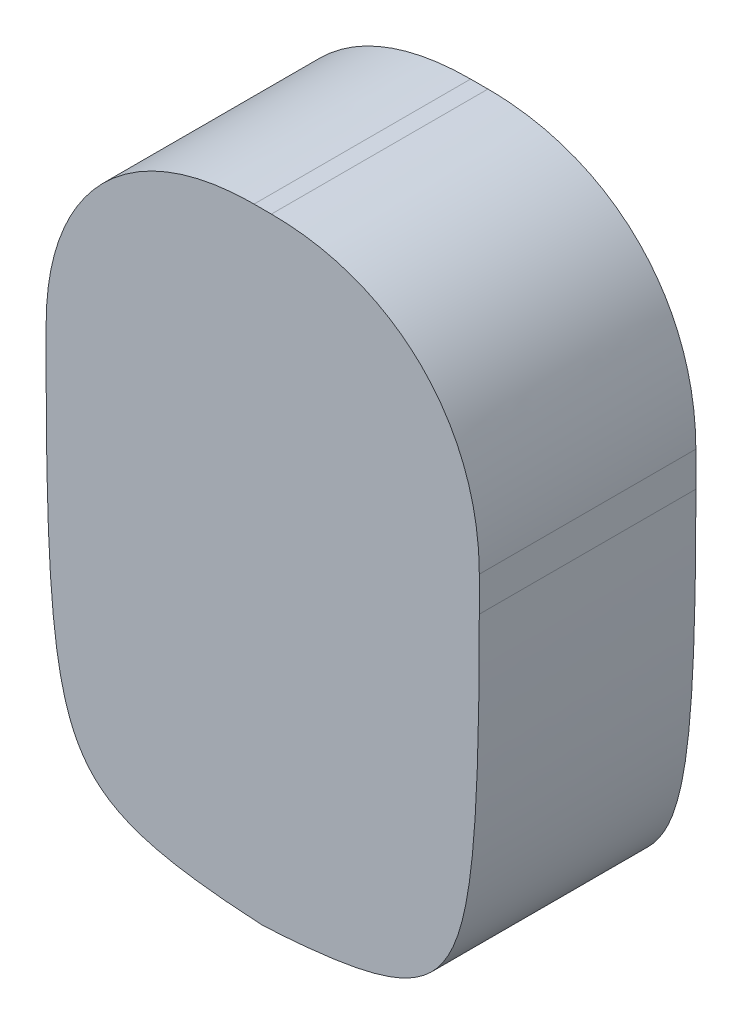
ISO-10303-21;
HEADER;
FILE_DESCRIPTION(('STEP AP214'),'2;1');
FILE_NAME('part.step','',(''),(''),'','','');
FILE_SCHEMA(('AUTOMOTIVE_DESIGN { 1 0 10303 214 1 1 1 1 }'));
ENDSEC;
DATA;
#1=APPLICATION_CONTEXT('core data for automotive mechanical design processes');
#2=APPLICATION_PROTOCOL_DEFINITION('international standard','automotive_design',2000,#1);
#3=PRODUCT_CONTEXT('',#1,'mechanical');
#4=PRODUCT('Part','Part','',(#3));
#5=PRODUCT_RELATED_PRODUCT_CATEGORY('part','',(#4));
#6=PRODUCT_DEFINITION_FORMATION('','',#4);
#7=PRODUCT_DEFINITION_CONTEXT('part definition',#1,'design');
#8=PRODUCT_DEFINITION('design','',#6,#7);
#9=PRODUCT_DEFINITION_SHAPE('','',#8);
#10=(LENGTH_UNIT() NAMED_UNIT(*) SI_UNIT(.MILLI.,.METRE.));
#11=(NAMED_UNIT(*) PLANE_ANGLE_UNIT() SI_UNIT($,.RADIAN.));
#12=(NAMED_UNIT(*) SI_UNIT($,.STERADIAN.) SOLID_ANGLE_UNIT());
#13=UNCERTAINTY_MEASURE_WITH_UNIT(LENGTH_MEASURE(1.E-05),#10,'distance_accuracy_value','');
#14=(GEOMETRIC_REPRESENTATION_CONTEXT(3) GLOBAL_UNCERTAINTY_ASSIGNED_CONTEXT((#13)) GLOBAL_UNIT_ASSIGNED_CONTEXT((#10,
#11,#12)) REPRESENTATION_CONTEXT('',''));
#15=CARTESIAN_POINT('',(0.,0.,0.));
#16=DIRECTION('',(0.,0.,1.));
#17=DIRECTION('',(1.,0.,0.));
#18=AXIS2_PLACEMENT_3D('',#15,#16,#17);
#19=CARTESIAN_POINT('',(-140.989583333333,-34.6223958333334,125.));
#20=DIRECTION('',(1.,0.,0.));
#21=DIRECTION('',(0.,1.,0.));
#22=AXIS2_PLACEMENT_3D('',#19,#20,#21);
#23=PLANE('',#22);
#24=DIRECTION('',(0.,-1.,0.));
#25=VECTOR('',#24,1.);
#26=CARTESIAN_POINT('',(-140.989583333333,-34.6223958333334,125.));
#27=LINE('',#26,#25);
#28=CARTESIAN_POINT('',(-140.989583333333,-154.622395833333,125.));
#29=VERTEX_POINT('',#28);
#30=CARTESIAN_POINT('',(-140.989583333333,-174.622395833333,125.));
#31=VERTEX_POINT('',#30);
#32=EDGE_CURVE('E147',#29,#31,#27,.T.);
#33=ORIENTED_EDGE('',*,*,#32,.F.);
#34=CARTESIAN_POINT('',(-140.989583333333,-154.622395833333,-6.24999999999998));
#35=CARTESIAN_POINT('',(-140.989583333333,-154.622395833333,39.5833333333333));
#36=CARTESIAN_POINT('',(-140.989583333333,-154.622395833333,85.4166666666667));
#37=CARTESIAN_POINT('',(-140.989583333333,-154.622395833333,131.25));
#38=(BOUNDED_CURVE() B_SPLINE_CURVE(3,(#34,#35,#36,#37),.UNSPECIFIED.,.F.,
.F.) B_SPLINE_CURVE_WITH_KNOTS((4,4),(-0.00625000000000001,0.13125),
.UNSPECIFIED.) CURVE() GEOMETRIC_REPRESENTATION_ITEM() RATIONAL_B_SPLINE_CURVE((1.,1.,1.,1.)) REPRESENTATION_ITEM(''));
#39=CARTESIAN_POINT('',(-140.989583333333,-154.622395833333,0.));
#40=VERTEX_POINT('',#39);
#41=EDGE_CURVE('E12',#29,#40,#38,.F.);
#42=ORIENTED_EDGE('',*,*,#41,.T.);
#43=DIRECTION('',(0.,-1.,0.));
#44=VECTOR('',#43,1.);
#45=CARTESIAN_POINT('',(-140.989583333333,-34.6223958333334,0.));
#46=LINE('',#45,#44);
#47=CARTESIAN_POINT('',(-140.989583333333,-174.622395833333,0.));
#48=VERTEX_POINT('',#47);
#49=EDGE_CURVE('E144',#40,#48,#46,.T.);
#50=ORIENTED_EDGE('',*,*,#49,.T.);
#51=CARTESIAN_POINT('',(-140.989583333333,-174.622395833333,131.25));
#52=CARTESIAN_POINT('',(-140.989583333333,-174.622395833333,85.4166666666667));
#53=CARTESIAN_POINT('',(-140.989583333333,-174.622395833333,39.5833333333333));
#54=CARTESIAN_POINT('',(-140.989583333333,-174.622395833333,-6.24999999999998));
#55=(BOUNDED_CURVE() B_SPLINE_CURVE(3,(#51,#52,#53,#54),.UNSPECIFIED.,.F.,
.F.) B_SPLINE_CURVE_WITH_KNOTS((4,4),(-0.00625,0.13125),
.UNSPECIFIED.) CURVE() GEOMETRIC_REPRESENTATION_ITEM() RATIONAL_B_SPLINE_CURVE((1.,1.,1.,1.)) REPRESENTATION_ITEM(''));
#56=EDGE_CURVE('E225',#48,#31,#55,.F.);
#57=ORIENTED_EDGE('',*,*,#56,.T.);
#58=EDGE_LOOP('',(#33,#42,#50,#57));
#59=FACE_BOUND('',#58,.T.);
#60=ADVANCED_FACE('F43',(#59),#23,.F.);
#61=CARTESIAN_POINT('',(109.010416666667,-34.6223958333334,125.));
#62=DIRECTION('',(-1.,0.,0.));
#63=DIRECTION('',(0.,-1.,0.));
#64=AXIS2_PLACEMENT_3D('',#61,#62,#63);
#65=PLANE('',#64);
#66=DIRECTION('',(0.,1.,0.));
#67=VECTOR('',#66,1.);
#68=CARTESIAN_POINT('',(109.010416666667,-34.6223958333334,0.));
#69=LINE('',#68,#67);
#70=CARTESIAN_POINT('',(109.010416666667,-174.622395833333,0.));
#71=VERTEX_POINT('',#70);
#72=CARTESIAN_POINT('',(109.010416666667,-154.622395833333,0.));
#73=VERTEX_POINT('',#72);
#74=EDGE_CURVE('E134',#71,#73,#69,.T.);
#75=ORIENTED_EDGE('',*,*,#74,.T.);
#76=CARTESIAN_POINT('',(109.010416666667,-154.622395833333,131.25));
#77=CARTESIAN_POINT('',(109.010416666667,-154.622395833333,85.4166666666667));
#78=CARTESIAN_POINT('',(109.010416666667,-154.622395833333,39.5833333333333));
#79=CARTESIAN_POINT('',(109.010416666667,-154.622395833333,-6.24999999999998));
#80=(BOUNDED_CURVE() B_SPLINE_CURVE(3,(#76,#77,#78,#79),.UNSPECIFIED.,.F.,
.F.) B_SPLINE_CURVE_WITH_KNOTS((4,4),(-0.00625,0.13125),
.UNSPECIFIED.) CURVE() GEOMETRIC_REPRESENTATION_ITEM() RATIONAL_B_SPLINE_CURVE((1.,1.,1.,1.)) REPRESENTATION_ITEM(''));
#81=CARTESIAN_POINT('',(109.010416666667,-154.622395833333,125.));
#82=VERTEX_POINT('',#81);
#83=EDGE_CURVE('E73',#73,#82,#80,.F.);
#84=ORIENTED_EDGE('',*,*,#83,.T.);
#85=DIRECTION('',(0.,1.,0.));
#86=VECTOR('',#85,1.);
#87=CARTESIAN_POINT('',(109.010416666667,-34.6223958333334,125.));
#88=LINE('',#87,#86);
#89=CARTESIAN_POINT('',(109.010416666667,-174.622395833333,125.));
#90=VERTEX_POINT('',#89);
#91=EDGE_CURVE('E135',#90,#82,#88,.T.);
#92=ORIENTED_EDGE('',*,*,#91,.F.);
#93=CARTESIAN_POINT('',(109.010416666667,-174.622395833333,-6.24999999999998));
#94=CARTESIAN_POINT('',(109.010416666667,-174.622395833333,39.5833333333333));
#95=CARTESIAN_POINT('',(109.010416666667,-174.622395833333,85.4166666666667));
#96=CARTESIAN_POINT('',(109.010416666667,-174.622395833333,131.25));
#97=(BOUNDED_CURVE() B_SPLINE_CURVE(3,(#93,#94,#95,#96),.UNSPECIFIED.,.F.,
.F.) B_SPLINE_CURVE_WITH_KNOTS((4,4),(-0.00625000000000001,0.13125),
.UNSPECIFIED.) CURVE() GEOMETRIC_REPRESENTATION_ITEM() RATIONAL_B_SPLINE_CURVE((1.,1.,1.,1.)) REPRESENTATION_ITEM(''));
#98=EDGE_CURVE('E118',#90,#71,#97,.F.);
#99=ORIENTED_EDGE('',*,*,#98,.T.);
#100=EDGE_LOOP('',(#75,#84,#92,#99));
#101=FACE_BOUND('',#100,.T.);
#102=ADVANCED_FACE('F133',(#101),#65,.F.);
#103=CARTESIAN_POINT('',(-140.989583333333,-34.6223958333334,125.));
#104=DIRECTION('',(0.,-1.,0.));
#105=DIRECTION('',(0.,0.,-1.));
#106=AXIS2_PLACEMENT_3D('',#103,#104,#105);
#107=PLANE('',#106);
#108=DIRECTION('',(-1.,0.,0.));
#109=VECTOR('',#108,1.);
#110=CARTESIAN_POINT('',(-140.989583333333,-34.6223958333334,125.));
#111=LINE('',#110,#109);
#112=CARTESIAN_POINT('',(-10.9895833333332,-34.6223958333334,125.));
#113=VERTEX_POINT('',#112);
#114=CARTESIAN_POINT('',(-20.9895833333333,-34.6223958333334,125.));
#115=VERTEX_POINT('',#114);
#116=EDGE_CURVE('E136',#113,#115,#111,.T.);
#117=ORIENTED_EDGE('',*,*,#116,.F.);
#118=CARTESIAN_POINT('',(-10.9895833333332,-34.6223958333334,-6.24999999999998));
#119=CARTESIAN_POINT('',(-10.9895833333332,-34.6223958333334,39.5833333333333));
#120=CARTESIAN_POINT('',(-10.9895833333332,-34.6223958333334,85.4166666666667));
#121=CARTESIAN_POINT('',(-10.9895833333332,-34.6223958333334,131.25));
#122=(BOUNDED_CURVE() B_SPLINE_CURVE(3,(#118,#119,#120,#121),.UNSPECIFIED.,.F.,
.F.) B_SPLINE_CURVE_WITH_KNOTS((4,4),(-0.00625000000000001,0.13125),
.UNSPECIFIED.) CURVE() GEOMETRIC_REPRESENTATION_ITEM() RATIONAL_B_SPLINE_CURVE((1.,1.,1.,1.)) REPRESENTATION_ITEM(''));
#123=CARTESIAN_POINT('',(-10.9895833333332,-34.6223958333334,0.));
#124=VERTEX_POINT('',#123);
#125=EDGE_CURVE('E343',#113,#124,#122,.F.);
#126=ORIENTED_EDGE('',*,*,#125,.T.);
#127=DIRECTION('',(-1.,0.,0.));
#128=VECTOR('',#127,1.);
#129=CARTESIAN_POINT('',(-140.989583333333,-34.6223958333334,0.));
#130=LINE('',#129,#128);
#131=CARTESIAN_POINT('',(-20.9895833333333,-34.6223958333334,0.));
#132=VERTEX_POINT('',#131);
#133=EDGE_CURVE('E143',#124,#132,#130,.T.);
#134=ORIENTED_EDGE('',*,*,#133,.T.);
#135=CARTESIAN_POINT('',(-20.9895833333333,-34.6223958333334,131.25));
#136=CARTESIAN_POINT('',(-20.9895833333333,-34.6223958333334,85.4166666666667));
#137=CARTESIAN_POINT('',(-20.9895833333333,-34.6223958333334,39.5833333333333));
#138=CARTESIAN_POINT('',(-20.9895833333333,-34.6223958333334,-6.24999999999998));
#139=(BOUNDED_CURVE() B_SPLINE_CURVE(3,(#135,#136,#137,#138),.UNSPECIFIED.,.F.,
.F.) B_SPLINE_CURVE_WITH_KNOTS((4,4),(-0.00625,0.13125),
.UNSPECIFIED.) CURVE() GEOMETRIC_REPRESENTATION_ITEM() RATIONAL_B_SPLINE_CURVE((1.,1.,1.,1.)) REPRESENTATION_ITEM(''));
#140=EDGE_CURVE('E339',#132,#115,#139,.F.);
#141=ORIENTED_EDGE('',*,*,#140,.T.);
#142=EDGE_LOOP('',(#117,#126,#134,#141));
#143=FACE_BOUND('',#142,.T.);
#144=ADVANCED_FACE('F183',(#143),#107,.F.);
#145=CARTESIAN_POINT('',(0.,0.,125.));
#146=DIRECTION('',(0.,0.,1.));
#147=DIRECTION('',(1.,0.,0.));
#148=AXIS2_PLACEMENT_3D('',#145,#146,#147);
#149=PLANE('',#148);
#150=ORIENTED_EDGE('',*,*,#91,.T.);
#151=CARTESIAN_POINT('',(-10.9895833333332,-34.6223958333334,125.));
#152=CARTESIAN_POINT('',(109.010416666667,-34.6223958333334,125.));
#153=CARTESIAN_POINT('',(109.010416666667,-154.622395833333,125.));
#154=(BOUNDED_CURVE() B_SPLINE_CURVE(2,(#151,#152,#153),.UNSPECIFIED.,.F.,
.F.) B_SPLINE_CURVE_WITH_KNOTS((3,3),(0.,1.),
.UNSPECIFIED.) CURVE() GEOMETRIC_REPRESENTATION_ITEM() RATIONAL_B_SPLINE_CURVE((1.,
0.818181818181818,1.)) REPRESENTATION_ITEM(''));
#155=EDGE_CURVE('E57',#82,#113,#154,.F.);
#156=ORIENTED_EDGE('',*,*,#155,.T.);
#157=ORIENTED_EDGE('',*,*,#116,.T.);
#158=CARTESIAN_POINT('',(-140.989583333333,-154.622395833333,125.));
#159=CARTESIAN_POINT('',(-140.989583333333,-34.6223958333334,125.));
#160=CARTESIAN_POINT('',(-20.9895833333333,-34.6223958333334,125.));
#161=(BOUNDED_CURVE() B_SPLINE_CURVE(2,(#158,#159,#160),.UNSPECIFIED.,.F.,
.F.) B_SPLINE_CURVE_WITH_KNOTS((3,3),(0.,1.),
.UNSPECIFIED.) CURVE() GEOMETRIC_REPRESENTATION_ITEM() RATIONAL_B_SPLINE_CURVE((1.,
0.818181818181818,1.)) REPRESENTATION_ITEM(''));
#162=EDGE_CURVE('E64',#115,#29,#161,.F.);
#163=ORIENTED_EDGE('',*,*,#162,.T.);
#164=ORIENTED_EDGE('',*,*,#32,.T.);
#165=CARTESIAN_POINT('',(79.0104166666668,-394.622395833333,125.));
#166=CARTESIAN_POINT('',(-140.989583333333,-394.622395833333,125.));
#167=CARTESIAN_POINT('',(-140.989583333333,-174.622395833333,125.));
#168=(BOUNDED_CURVE() B_SPLINE_CURVE(2,(#165,#166,#167),.UNSPECIFIED.,.F.,
.F.) B_SPLINE_CURVE_WITH_KNOTS((3,3),(0.,1.),
.UNSPECIFIED.) CURVE() GEOMETRIC_REPRESENTATION_ITEM() RATIONAL_B_SPLINE_CURVE((1.,3.,1.)) REPRESENTATION_ITEM(''));
#169=CARTESIAN_POINT('',(-15.9895691870634,-392.697016077167,125.));
#170=VERTEX_POINT('',#169);
#171=EDGE_CURVE('E128',#31,#170,#168,.F.);
#172=ORIENTED_EDGE('',*,*,#171,.T.);
#173=CARTESIAN_POINT('',(109.010416666667,-174.622395833333,125.));
#174=CARTESIAN_POINT('',(109.010416666667,-394.622395833333,125.));
#175=CARTESIAN_POINT('',(-110.989583333333,-394.622395833333,125.));
#176=(BOUNDED_CURVE() B_SPLINE_CURVE(2,(#173,#174,#175),.UNSPECIFIED.,.F.,
.F.) B_SPLINE_CURVE_WITH_KNOTS((3,3),(0.,1.),
.UNSPECIFIED.) CURVE() GEOMETRIC_REPRESENTATION_ITEM() RATIONAL_B_SPLINE_CURVE((1.,3.,1.)) REPRESENTATION_ITEM(''));
#177=EDGE_CURVE('E213',#170,#90,#176,.F.);
#178=ORIENTED_EDGE('',*,*,#177,.T.);
#179=EDGE_LOOP('',(#150,#156,#157,#163,#164,#172,#178));
#180=FACE_BOUND('',#179,.T.);
#181=ADVANCED_FACE('F181',(#180),#149,.T.);
#182=CARTESIAN_POINT('',(0.,0.,0.));
#183=DIRECTION('',(0.,0.,1.));
#184=DIRECTION('',(1.,0.,0.));
#185=AXIS2_PLACEMENT_3D('',#182,#183,#184);
#186=PLANE('',#185);
#187=ORIENTED_EDGE('',*,*,#133,.F.);
#188=CARTESIAN_POINT('',(109.010416666667,-154.622395833333,0.));
#189=CARTESIAN_POINT('',(109.010416666667,-34.6223958333334,0.));
#190=CARTESIAN_POINT('',(-10.9895833333332,-34.6223958333334,0.));
#191=(BOUNDED_CURVE() B_SPLINE_CURVE(2,(#188,#189,#190),.UNSPECIFIED.,.F.,
.F.) B_SPLINE_CURVE_WITH_KNOTS((3,3),(0.,1.),
.UNSPECIFIED.) CURVE() GEOMETRIC_REPRESENTATION_ITEM() RATIONAL_B_SPLINE_CURVE((1.,
0.818181818181818,1.)) REPRESENTATION_ITEM(''));
#192=EDGE_CURVE('E141',#124,#73,#191,.F.);
#193=ORIENTED_EDGE('',*,*,#192,.T.);
#194=ORIENTED_EDGE('',*,*,#74,.F.);
#195=CARTESIAN_POINT('',(-110.989583333333,-394.622395833333,0.));
#196=CARTESIAN_POINT('',(109.010416666667,-394.622395833333,0.));
#197=CARTESIAN_POINT('',(109.010416666667,-174.622395833333,0.));
#198=(BOUNDED_CURVE() B_SPLINE_CURVE(2,(#195,#196,#197),.UNSPECIFIED.,.F.,
.F.) B_SPLINE_CURVE_WITH_KNOTS((3,3),(0.,1.),
.UNSPECIFIED.) CURVE() GEOMETRIC_REPRESENTATION_ITEM() RATIONAL_B_SPLINE_CURVE((1.,3.,1.)) REPRESENTATION_ITEM(''));
#199=CARTESIAN_POINT('',(-15.989562930035,-392.696923251727,0.));
#200=VERTEX_POINT('',#199);
#201=EDGE_CURVE('E113',#71,#200,#198,.F.);
#202=ORIENTED_EDGE('',*,*,#201,.T.);
#203=CARTESIAN_POINT('',(-140.989583333333,-174.622395833333,0.));
#204=CARTESIAN_POINT('',(-140.989583333333,-394.622395833333,0.));
#205=CARTESIAN_POINT('',(79.0104166666668,-394.622395833333,0.));
#206=(BOUNDED_CURVE() B_SPLINE_CURVE(2,(#203,#204,#205),.UNSPECIFIED.,.F.,
.F.) B_SPLINE_CURVE_WITH_KNOTS((3,3),(0.,1.),
.UNSPECIFIED.) CURVE() GEOMETRIC_REPRESENTATION_ITEM() RATIONAL_B_SPLINE_CURVE((1.,3.,1.)) REPRESENTATION_ITEM(''));
#207=EDGE_CURVE('E129',#200,#48,#206,.F.);
#208=ORIENTED_EDGE('',*,*,#207,.T.);
#209=ORIENTED_EDGE('',*,*,#49,.F.);
#210=CARTESIAN_POINT('',(-20.9895833333333,-34.6223958333334,0.));
#211=CARTESIAN_POINT('',(-140.989583333333,-34.6223958333334,0.));
#212=CARTESIAN_POINT('',(-140.989583333333,-154.622395833333,0.));
#213=(BOUNDED_CURVE() B_SPLINE_CURVE(2,(#210,#211,#212),.UNSPECIFIED.,.F.,
.F.) B_SPLINE_CURVE_WITH_KNOTS((3,3),(0.,1.),
.UNSPECIFIED.) CURVE() GEOMETRIC_REPRESENTATION_ITEM() RATIONAL_B_SPLINE_CURVE((1.,
0.818181818181818,1.)) REPRESENTATION_ITEM(''));
#214=EDGE_CURVE('E167',#40,#132,#213,.F.);
#215=ORIENTED_EDGE('',*,*,#214,.T.);
#216=EDGE_LOOP('',(#187,#193,#194,#202,#208,#209,#215));
#217=FACE_BOUND('',#216,.T.);
#218=ADVANCED_FACE('F140',(#217),#186,.F.);
#219=CARTESIAN_POINT('',(79.0104166666668,-394.622395833333,131.25));
#220=CARTESIAN_POINT('',(79.0104166666668,-394.622395833333,85.4166666666667));
#221=CARTESIAN_POINT('',(79.0104166666668,-394.622395833333,39.5833333333333));
#222=CARTESIAN_POINT('',(79.0104166666668,-394.622395833333,-6.24999999999998));
#223=CARTESIAN_POINT('',(-140.989583333333,-394.622395833333,131.25));
#224=CARTESIAN_POINT('',(-140.989583333333,-394.622395833333,85.4166666666667));
#225=CARTESIAN_POINT('',(-140.989583333333,-394.622395833333,39.5833333333333));
#226=CARTESIAN_POINT('',(-140.989583333333,-394.622395833333,-6.24999999999998));
#227=CARTESIAN_POINT('',(-140.989583333333,-174.622395833333,131.25));
#228=CARTESIAN_POINT('',(-140.989583333333,-174.622395833333,85.4166666666667));
#229=CARTESIAN_POINT('',(-140.989583333333,-174.622395833333,39.5833333333333));
#230=CARTESIAN_POINT('',(-140.989583333333,-174.622395833333,-6.24999999999998));
#231=(BOUNDED_SURFACE() B_SPLINE_SURFACE(2,3,((#219,#220,#221,#222),(#223,#224,#225,#226),(#227,
#228,#229,#230)),.UNSPECIFIED.,.F.,.F.,.F.) B_SPLINE_SURFACE_WITH_KNOTS((3,3),(4,4),(0.,1.),
(-0.00625,0.13125),
.UNSPECIFIED.) GEOMETRIC_REPRESENTATION_ITEM() RATIONAL_B_SPLINE_SURFACE(((1.,1.,1.,1.),(3.,3.,
3.,3.),(1.,1.,1.,1.))) REPRESENTATION_ITEM('') SURFACE());
#232=CARTESIAN_POINT('',(-15.9895833333334,-392.697298605329,131.25));
#233=CARTESIAN_POINT('',(-15.9895833333334,-392.697298605329,85.4166666666667));
#234=CARTESIAN_POINT('',(-15.9895833333334,-392.697298605329,39.5833333333333));
#235=CARTESIAN_POINT('',(-15.9895833333334,-392.697298605329,-6.24999999999998));
#236=(BOUNDED_CURVE() B_SPLINE_CURVE(3,(#232,#233,#234,#235),.UNSPECIFIED.,.F.,
.F.) B_SPLINE_CURVE_WITH_KNOTS((4,4),(-0.00625,0.13125),
.UNSPECIFIED.) CURVE() GEOMETRIC_REPRESENTATION_ITEM() RATIONAL_B_SPLINE_CURVE((1.39284526570195,
1.39284526570195,1.39284526570195,1.39284526570195)) REPRESENTATION_ITEM(''));
#237=EDGE_CURVE('E121',#170,#200,#236,.T.);
#238=ORIENTED_EDGE('',*,*,#237,.F.);
#239=ORIENTED_EDGE('',*,*,#171,.F.);
#240=ORIENTED_EDGE('',*,*,#56,.F.);
#241=ORIENTED_EDGE('',*,*,#207,.F.);
#242=EDGE_LOOP('',(#238,#239,#240,#241));
#243=FACE_BOUND('',#242,.T.);
#244=ADVANCED_FACE('F180',(#243),#231,.T.);
#245=CARTESIAN_POINT('',(109.010416666667,-174.622395833333,131.25));
#246=CARTESIAN_POINT('',(109.010416666667,-174.622395833333,85.4166666666667));
#247=CARTESIAN_POINT('',(109.010416666667,-174.622395833333,39.5833333333333));
#248=CARTESIAN_POINT('',(109.010416666667,-174.622395833333,-6.24999999999998));
#249=CARTESIAN_POINT('',(109.010416666667,-394.622395833333,131.25));
#250=CARTESIAN_POINT('',(109.010416666667,-394.622395833333,85.4166666666667));
#251=CARTESIAN_POINT('',(109.010416666667,-394.622395833333,39.5833333333333));
#252=CARTESIAN_POINT('',(109.010416666667,-394.622395833333,-6.24999999999998));
#253=CARTESIAN_POINT('',(-110.989583333333,-394.622395833333,131.25));
#254=CARTESIAN_POINT('',(-110.989583333333,-394.622395833333,85.4166666666667));
#255=CARTESIAN_POINT('',(-110.989583333333,-394.622395833333,39.5833333333333));
#256=CARTESIAN_POINT('',(-110.989583333333,-394.622395833333,-6.24999999999998));
#257=(BOUNDED_SURFACE() B_SPLINE_SURFACE(2,3,((#245,#246,#247,#248),(#249,#250,#251,#252),(#253,
#254,#255,#256)),.UNSPECIFIED.,.F.,.F.,.F.) B_SPLINE_SURFACE_WITH_KNOTS((3,3),(4,4),(0.,1.),
(-0.00625,0.13125),
.UNSPECIFIED.) GEOMETRIC_REPRESENTATION_ITEM() RATIONAL_B_SPLINE_SURFACE(((1.,1.,1.,1.),(3.,3.,
3.,3.),(1.,1.,1.,1.))) REPRESENTATION_ITEM('') SURFACE());
#258=ORIENTED_EDGE('',*,*,#177,.F.);
#259=ORIENTED_EDGE('',*,*,#237,.T.);
#260=ORIENTED_EDGE('',*,*,#201,.F.);
#261=ORIENTED_EDGE('',*,*,#98,.F.);
#262=EDGE_LOOP('',(#258,#259,#260,#261));
#263=FACE_BOUND('',#262,.T.);
#264=ADVANCED_FACE('F117',(#263),#257,.T.);
#265=CARTESIAN_POINT('',(-10.9895833333332,-34.6223958333334,131.25));
#266=CARTESIAN_POINT('',(-10.9895833333332,-34.6223958333334,85.4166666666667));
#267=CARTESIAN_POINT('',(-10.9895833333332,-34.6223958333334,39.5833333333333));
#268=CARTESIAN_POINT('',(-10.9895833333332,-34.6223958333334,-6.24999999999998));
#269=CARTESIAN_POINT('',(109.010416666667,-34.6223958333334,131.25));
#270=CARTESIAN_POINT('',(109.010416666667,-34.6223958333334,85.4166666666667));
#271=CARTESIAN_POINT('',(109.010416666667,-34.6223958333334,39.5833333333333));
#272=CARTESIAN_POINT('',(109.010416666667,-34.6223958333334,-6.24999999999998));
#273=CARTESIAN_POINT('',(109.010416666667,-154.622395833333,131.25));
#274=CARTESIAN_POINT('',(109.010416666667,-154.622395833333,85.4166666666667));
#275=CARTESIAN_POINT('',(109.010416666667,-154.622395833333,39.5833333333333));
#276=CARTESIAN_POINT('',(109.010416666667,-154.622395833333,-6.24999999999998));
#277=(BOUNDED_SURFACE() B_SPLINE_SURFACE(2,3,((#265,#266,#267,#268),(#269,#270,#271,#272),(#273,
#274,#275,#276)),.UNSPECIFIED.,.F.,.F.,.F.) B_SPLINE_SURFACE_WITH_KNOTS((3,3),(4,4),(0.,1.),
(-0.00625,0.13125),
.UNSPECIFIED.) GEOMETRIC_REPRESENTATION_ITEM() RATIONAL_B_SPLINE_SURFACE(((1.,1.,1.,1.),
(0.818181818181818,0.818181818181818,0.818181818181818,0.818181818181818),(1.,1.,1.,1.))) REPRESENTATION_ITEM('') SURFACE());
#278=ORIENTED_EDGE('',*,*,#155,.F.);
#279=ORIENTED_EDGE('',*,*,#83,.F.);
#280=ORIENTED_EDGE('',*,*,#192,.F.);
#281=ORIENTED_EDGE('',*,*,#125,.F.);
#282=EDGE_LOOP('',(#278,#279,#280,#281));
#283=FACE_BOUND('',#282,.T.);
#284=ADVANCED_FACE('F264',(#283),#277,.T.);
#285=CARTESIAN_POINT('',(-140.989583333333,-154.622395833333,131.25));
#286=CARTESIAN_POINT('',(-140.989583333333,-154.622395833333,85.4166666666667));
#287=CARTESIAN_POINT('',(-140.989583333333,-154.622395833333,39.5833333333333));
#288=CARTESIAN_POINT('',(-140.989583333333,-154.622395833333,-6.24999999999998));
#289=CARTESIAN_POINT('',(-140.989583333333,-34.6223958333334,131.25));
#290=CARTESIAN_POINT('',(-140.989583333333,-34.6223958333334,85.4166666666667));
#291=CARTESIAN_POINT('',(-140.989583333333,-34.6223958333334,39.5833333333333));
#292=CARTESIAN_POINT('',(-140.989583333333,-34.6223958333334,-6.24999999999998));
#293=CARTESIAN_POINT('',(-20.9895833333333,-34.6223958333334,131.25));
#294=CARTESIAN_POINT('',(-20.9895833333333,-34.6223958333334,85.4166666666667));
#295=CARTESIAN_POINT('',(-20.9895833333333,-34.6223958333334,39.5833333333333));
#296=CARTESIAN_POINT('',(-20.9895833333333,-34.6223958333334,-6.24999999999998));
#297=(BOUNDED_SURFACE() B_SPLINE_SURFACE(2,3,((#285,#286,#287,#288),(#289,#290,#291,#292),(#293,
#294,#295,#296)),.UNSPECIFIED.,.F.,.F.,.F.) B_SPLINE_SURFACE_WITH_KNOTS((3,3),(4,4),(0.,1.),
(-0.00625,0.13125),
.UNSPECIFIED.) GEOMETRIC_REPRESENTATION_ITEM() RATIONAL_B_SPLINE_SURFACE(((1.,1.,1.,1.),
(0.818181818181818,0.818181818181818,0.818181818181818,0.818181818181818),(1.,1.,1.,1.))) REPRESENTATION_ITEM('') SURFACE());
#298=ORIENTED_EDGE('',*,*,#162,.F.);
#299=ORIENTED_EDGE('',*,*,#140,.F.);
#300=ORIENTED_EDGE('',*,*,#214,.F.);
#301=ORIENTED_EDGE('',*,*,#41,.F.);
#302=EDGE_LOOP('',(#298,#299,#300,#301));
#303=FACE_BOUND('',#302,.T.);
#304=ADVANCED_FACE('F46',(#303),#297,.T.);
#305=CLOSED_SHELL('',(#60,#102,#144,#181,#218,#244,#264,#284,#304));
#306=MANIFOLD_SOLID_BREP('B2',#305);
#307=ADVANCED_BREP_SHAPE_REPRESENTATION('',(#18,#306),#14);
#308=SHAPE_DEFINITION_REPRESENTATION(#9,#307);
ENDSEC;
END-ISO-10303-21;
